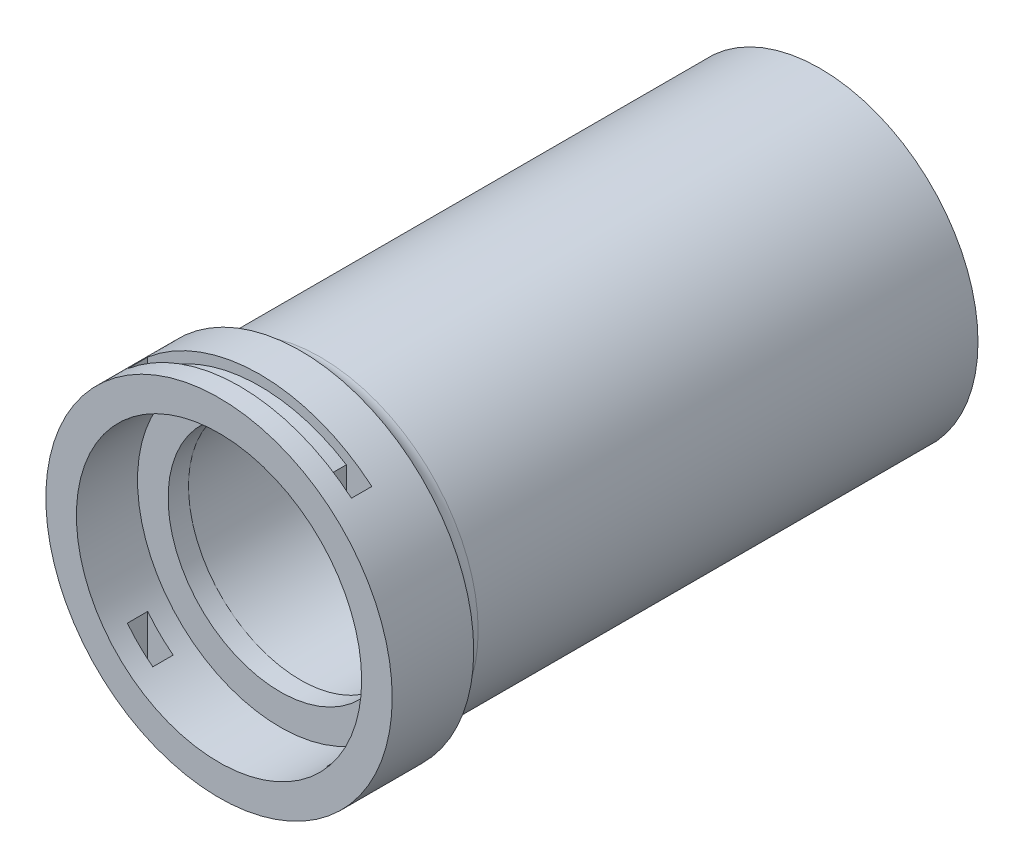
ISO-10303-21;
HEADER;
FILE_DESCRIPTION(('STEP AP214'),'2;1');
FILE_NAME('part.step','',(''),(''),'','','');
FILE_SCHEMA(('AUTOMOTIVE_DESIGN { 1 0 10303 214 1 1 1 1 }'));
ENDSEC;
DATA;
#1=APPLICATION_CONTEXT('core data for automotive mechanical design processes');
#2=APPLICATION_PROTOCOL_DEFINITION('international standard','automotive_design',2000,#1);
#3=PRODUCT_CONTEXT('',#1,'mechanical');
#4=PRODUCT('Part','Part','',(#3));
#5=PRODUCT_RELATED_PRODUCT_CATEGORY('part','',(#4));
#6=PRODUCT_DEFINITION_FORMATION('','',#4);
#7=PRODUCT_DEFINITION_CONTEXT('part definition',#1,'design');
#8=PRODUCT_DEFINITION('design','',#6,#7);
#9=PRODUCT_DEFINITION_SHAPE('','',#8);
#10=(LENGTH_UNIT() NAMED_UNIT(*) SI_UNIT(.MILLI.,.METRE.));
#11=(NAMED_UNIT(*) PLANE_ANGLE_UNIT() SI_UNIT($,.RADIAN.));
#12=(NAMED_UNIT(*) SI_UNIT($,.STERADIAN.) SOLID_ANGLE_UNIT());
#13=UNCERTAINTY_MEASURE_WITH_UNIT(LENGTH_MEASURE(1.E-05),#10,'distance_accuracy_value','');
#14=(GEOMETRIC_REPRESENTATION_CONTEXT(3) GLOBAL_UNCERTAINTY_ASSIGNED_CONTEXT((#13)) GLOBAL_UNIT_ASSIGNED_CONTEXT((#10,
#11,#12)) REPRESENTATION_CONTEXT('',''));
#15=CARTESIAN_POINT('',(0.,0.,0.));
#16=DIRECTION('',(0.,0.,1.));
#17=DIRECTION('',(1.,0.,0.));
#18=AXIS2_PLACEMENT_3D('',#15,#16,#17);
#19=CARTESIAN_POINT('',(-8.5,-20.,0.));
#20=DIRECTION('',(1.,0.,0.));
#21=DIRECTION('',(0.,0.,-1.));
#22=AXIS2_PLACEMENT_3D('',#19,#20,#21);
#23=PLANE('',#22);
#24=DIRECTION('',(0.,0.,1.));
#25=VECTOR('',#24,1.);
#26=CARTESIAN_POINT('',(-8.5,13.555441711726,22.));
#27=LINE('',#26,#25);
#28=CARTESIAN_POINT('',(-8.5,13.555441711726,22.));
#29=VERTEX_POINT('',#28);
#30=CARTESIAN_POINT('',(-8.5,13.555441711726,24.));
#31=VERTEX_POINT('',#30);
#32=EDGE_CURVE('E150',#29,#31,#27,.T.);
#33=ORIENTED_EDGE('',*,*,#32,.F.);
#34=DIRECTION('',(0.,1.,0.));
#35=VECTOR('',#34,1.);
#36=CARTESIAN_POINT('',(-8.5,-20.,22.));
#37=LINE('',#36,#35);
#38=CARTESIAN_POINT('',(-8.5,11.1242977306435,22.));
#39=VERTEX_POINT('',#38);
#40=EDGE_CURVE('E194',#39,#29,#37,.T.);
#41=ORIENTED_EDGE('',*,*,#40,.F.);
#42=DIRECTION('',(0.,0.,1.));
#43=VECTOR('',#42,1.);
#44=CARTESIAN_POINT('',(-8.5,11.1242977306435,20.));
#45=LINE('',#44,#43);
#46=CARTESIAN_POINT('',(-8.5,11.1242977306435,24.));
#47=VERTEX_POINT('',#46);
#48=EDGE_CURVE('E275',#47,#39,#45,.F.);
#49=ORIENTED_EDGE('',*,*,#48,.F.);
#50=DIRECTION('',(0.,1.,0.));
#51=VECTOR('',#50,1.);
#52=CARTESIAN_POINT('',(-8.5,-20.,24.));
#53=LINE('',#52,#51);
#54=EDGE_CURVE('E184',#47,#31,#53,.T.);
#55=ORIENTED_EDGE('',*,*,#54,.T.);
#56=EDGE_LOOP('',(#33,#41,#49,#55));
#57=FACE_BOUND('',#56,.T.);
#58=ADVANCED_FACE('F33',(#57),#23,.F.);
#59=CARTESIAN_POINT('',(8.5,-20.,0.));
#60=DIRECTION('',(1.,0.,0.));
#61=DIRECTION('',(0.,0.,-1.));
#62=AXIS2_PLACEMENT_3D('',#59,#60,#61);
#63=PLANE('',#62);
#64=DIRECTION('',(0.,1.,0.));
#65=VECTOR('',#64,1.);
#66=CARTESIAN_POINT('',(8.5,-20.,22.));
#67=LINE('',#66,#65);
#68=CARTESIAN_POINT('',(8.5,11.1242977306435,22.));
#69=VERTEX_POINT('',#68);
#70=CARTESIAN_POINT('',(8.5,13.555441711726,22.));
#71=VERTEX_POINT('',#70);
#72=EDGE_CURVE('E165',#69,#71,#67,.T.);
#73=ORIENTED_EDGE('',*,*,#72,.T.);
#74=DIRECTION('',(0.,0.,1.));
#75=VECTOR('',#74,1.);
#76=CARTESIAN_POINT('',(8.5,13.555441711726,22.));
#77=LINE('',#76,#75);
#78=CARTESIAN_POINT('',(8.5,13.555441711726,24.));
#79=VERTEX_POINT('',#78);
#80=EDGE_CURVE('E11',#71,#79,#77,.T.);
#81=ORIENTED_EDGE('',*,*,#80,.T.);
#82=DIRECTION('',(0.,1.,0.));
#83=VECTOR('',#82,1.);
#84=CARTESIAN_POINT('',(8.5,-20.,24.));
#85=LINE('',#84,#83);
#86=CARTESIAN_POINT('',(8.5,11.1242977306435,24.));
#87=VERTEX_POINT('',#86);
#88=EDGE_CURVE('E162',#87,#79,#85,.T.);
#89=ORIENTED_EDGE('',*,*,#88,.F.);
#90=DIRECTION('',(0.,0.,1.));
#91=VECTOR('',#90,1.);
#92=CARTESIAN_POINT('',(8.5,11.1242977306435,20.));
#93=LINE('',#92,#91);
#94=EDGE_CURVE('E290',#87,#69,#93,.F.);
#95=ORIENTED_EDGE('',*,*,#94,.T.);
#96=EDGE_LOOP('',(#73,#81,#89,#95));
#97=FACE_BOUND('',#96,.T.);
#98=ADVANCED_FACE('F161',(#97),#63,.T.);
#99=CARTESIAN_POINT('',(0.,0.,18.));
#100=DIRECTION('',(0.,0.,1.));
#101=DIRECTION('',(1.,0.,0.));
#102=AXIS2_PLACEMENT_3D('',#99,#100,#101);
#103=CYLINDRICAL_SURFACE('',#102,17.);
#104=CARTESIAN_POINT('',(0.,0.,22.));
#105=DIRECTION('',(0.,0.,1.));
#106=DIRECTION('',(1.,0.,0.));
#107=AXIS2_PLACEMENT_3D('',#104,#105,#106);
#108=CIRCLE('',#107,17.);
#109=CARTESIAN_POINT('',(-11.,12.9614813968157,22.));
#110=VERTEX_POINT('',#109);
#111=CARTESIAN_POINT('',(11.,12.9614813968157,22.));
#112=VERTEX_POINT('',#111);
#113=EDGE_CURVE('E199',#110,#112,#108,.F.);
#114=ORIENTED_EDGE('',*,*,#113,.T.);
#115=DIRECTION('',(0.,0.,1.));
#116=VECTOR('',#115,1.);
#117=CARTESIAN_POINT('',(11.,12.9614813968157,18.));
#118=LINE('',#117,#116);
#119=CARTESIAN_POINT('',(11.,12.9614813968157,24.));
#120=VERTEX_POINT('',#119);
#121=EDGE_CURVE('E178',#112,#120,#118,.T.);
#122=ORIENTED_EDGE('',*,*,#121,.T.);
#123=CARTESIAN_POINT('',(0.,0.,24.));
#124=DIRECTION('',(0.,0.,1.));
#125=DIRECTION('',(1.,0.,0.));
#126=AXIS2_PLACEMENT_3D('',#123,#124,#125);
#127=CIRCLE('',#126,17.);
#128=CARTESIAN_POINT('',(-11.,12.9614813968157,24.));
#129=VERTEX_POINT('',#128);
#130=EDGE_CURVE('E207',#129,#120,#127,.F.);
#131=ORIENTED_EDGE('',*,*,#130,.F.);
#132=DIRECTION('',(0.,0.,1.));
#133=VECTOR('',#132,1.);
#134=CARTESIAN_POINT('',(-11.,12.9614813968157,18.));
#135=LINE('',#134,#133);
#136=EDGE_CURVE('E202',#110,#129,#135,.T.);
#137=ORIENTED_EDGE('',*,*,#136,.F.);
#138=EDGE_LOOP('',(#114,#122,#131,#137));
#139=FACE_BOUND('',#138,.T.);
#140=CARTESIAN_POINT('',(0.,0.,26.));
#141=DIRECTION('',(0.,0.,1.));
#142=DIRECTION('',(1.,0.,0.));
#143=AXIS2_PLACEMENT_3D('',#140,#141,#142);
#144=CIRCLE('',#143,17.);
#145=CARTESIAN_POINT('',(17.,0.,26.));
#146=VERTEX_POINT('',#145);
#147=EDGE_CURVE('E220',#146,#146,#144,.T.);
#148=ORIENTED_EDGE('',*,*,#147,.F.);
#149=EDGE_LOOP('',(#148));
#150=FACE_BOUND('',#149,.T.);
#151=CARTESIAN_POINT('',(0.,0.,18.));
#152=DIRECTION('',(0.,0.,1.));
#153=DIRECTION('',(1.,0.,0.));
#154=AXIS2_PLACEMENT_3D('',#151,#152,#153);
#155=CIRCLE('',#154,17.);
#156=CARTESIAN_POINT('',(17.,0.,18.));
#157=VERTEX_POINT('',#156);
#158=EDGE_CURVE('E223',#157,#157,#155,.T.);
#159=ORIENTED_EDGE('',*,*,#158,.T.);
#160=EDGE_LOOP('',(#159));
#161=FACE_BOUND('',#160,.T.);
#162=DIRECTION('',(0.,0.,1.));
#163=VECTOR('',#162,1.);
#164=CARTESIAN_POINT('',(11.,-12.9614813968157,18.));
#165=LINE('',#164,#163);
#166=CARTESIAN_POINT('',(11.,-12.9614813968157,24.));
#167=VERTEX_POINT('',#166);
#168=CARTESIAN_POINT('',(11.,-12.9614813968157,22.));
#169=VERTEX_POINT('',#168);
#170=EDGE_CURVE('E181',#167,#169,#165,.F.);
#171=ORIENTED_EDGE('',*,*,#170,.T.);
#172=CARTESIAN_POINT('',(-11.,-12.9614813968157,22.));
#173=VERTEX_POINT('',#172);
#174=EDGE_CURVE('E201',#169,#173,#108,.F.);
#175=ORIENTED_EDGE('',*,*,#174,.T.);
#176=DIRECTION('',(0.,0.,1.));
#177=VECTOR('',#176,1.);
#178=CARTESIAN_POINT('',(-11.,-12.9614813968157,18.));
#179=LINE('',#178,#177);
#180=CARTESIAN_POINT('',(-11.,-12.9614813968157,24.));
#181=VERTEX_POINT('',#180);
#182=EDGE_CURVE('E204',#181,#173,#179,.F.);
#183=ORIENTED_EDGE('',*,*,#182,.F.);
#184=EDGE_CURVE('E56',#167,#181,#127,.F.);
#185=ORIENTED_EDGE('',*,*,#184,.F.);
#186=EDGE_LOOP('',(#171,#175,#183,#185));
#187=FACE_BOUND('',#186,.T.);
#188=ADVANCED_FACE('F364',(#139,#150,#161,#187),#103,.T.);
#189=DIRECTION('',(0.,0.,1.));
#190=VECTOR('',#189,1.);
#191=CARTESIAN_POINT('',(-8.5,-13.555441711726,22.));
#192=LINE('',#191,#190);
#193=CARTESIAN_POINT('',(-8.5,-13.555441711726,24.));
#194=VERTEX_POINT('',#193);
#195=CARTESIAN_POINT('',(-8.5,-13.555441711726,22.));
#196=VERTEX_POINT('',#195);
#197=EDGE_CURVE('E170',#194,#196,#192,.F.);
#198=ORIENTED_EDGE('',*,*,#197,.F.);
#199=CARTESIAN_POINT('',(-8.5,-11.1242977306435,24.));
#200=VERTEX_POINT('',#199);
#201=EDGE_CURVE('E197',#194,#200,#53,.T.);
#202=ORIENTED_EDGE('',*,*,#201,.T.);
#203=DIRECTION('',(0.,0.,1.));
#204=VECTOR('',#203,1.);
#205=CARTESIAN_POINT('',(-8.5,-11.1242977306435,20.));
#206=LINE('',#205,#204);
#207=CARTESIAN_POINT('',(-8.5,-11.1242977306435,22.));
#208=VERTEX_POINT('',#207);
#209=EDGE_CURVE('E250',#208,#200,#206,.T.);
#210=ORIENTED_EDGE('',*,*,#209,.F.);
#211=EDGE_CURVE('E193',#196,#208,#37,.T.);
#212=ORIENTED_EDGE('',*,*,#211,.F.);
#213=EDGE_LOOP('',(#198,#202,#210,#212));
#214=FACE_BOUND('',#213,.T.);
#215=ADVANCED_FACE('F360',(#214),#23,.F.);
#216=CARTESIAN_POINT('',(8.5,-13.555441711726,24.));
#217=VERTEX_POINT('',#216);
#218=CARTESIAN_POINT('',(8.5,-11.1242977306435,24.));
#219=VERTEX_POINT('',#218);
#220=EDGE_CURVE('E169',#217,#219,#85,.T.);
#221=ORIENTED_EDGE('',*,*,#220,.F.);
#222=DIRECTION('',(0.,0.,1.));
#223=VECTOR('',#222,1.);
#224=CARTESIAN_POINT('',(8.5,-13.555441711726,22.));
#225=LINE('',#224,#223);
#226=CARTESIAN_POINT('',(8.5,-13.555441711726,22.));
#227=VERTEX_POINT('',#226);
#228=EDGE_CURVE('E173',#217,#227,#225,.F.);
#229=ORIENTED_EDGE('',*,*,#228,.T.);
#230=CARTESIAN_POINT('',(8.5,-11.1242977306435,22.));
#231=VERTEX_POINT('',#230);
#232=EDGE_CURVE('E182',#227,#231,#67,.T.);
#233=ORIENTED_EDGE('',*,*,#232,.T.);
#234=DIRECTION('',(0.,0.,1.));
#235=VECTOR('',#234,1.);
#236=CARTESIAN_POINT('',(8.5,-11.1242977306435,20.));
#237=LINE('',#236,#235);
#238=EDGE_CURVE('E41',#231,#219,#237,.T.);
#239=ORIENTED_EDGE('',*,*,#238,.T.);
#240=EDGE_LOOP('',(#221,#229,#233,#239));
#241=FACE_BOUND('',#240,.T.);
#242=ADVANCED_FACE('F366',(#241),#63,.T.);
#243=CARTESIAN_POINT('',(0.,0.,20.));
#244=DIRECTION('',(0.,0.,1.));
#245=DIRECTION('',(1.,0.,0.));
#246=AXIS2_PLACEMENT_3D('',#243,#244,#245);
#247=CYLINDRICAL_SURFACE('',#246,14.);
#248=ORIENTED_EDGE('',*,*,#94,.F.);
#249=CARTESIAN_POINT('',(0.,0.,24.));
#250=DIRECTION('',(0.,0.,-1.));
#251=DIRECTION('',(-1.,0.,0.));
#252=AXIS2_PLACEMENT_3D('',#249,#250,#251);
#253=CIRCLE('',#252,14.);
#254=CARTESIAN_POINT('',(11.,8.66025403784439,24.));
#255=VERTEX_POINT('',#254);
#256=EDGE_CURVE('E168',#255,#87,#253,.F.);
#257=ORIENTED_EDGE('',*,*,#256,.F.);
#258=DIRECTION('',(0.,0.,1.));
#259=VECTOR('',#258,1.);
#260=CARTESIAN_POINT('',(11.,8.66025403784439,20.));
#261=LINE('',#260,#259);
#262=CARTESIAN_POINT('',(11.,8.66025403784439,22.));
#263=VERTEX_POINT('',#262);
#264=EDGE_CURVE('E283',#263,#255,#261,.T.);
#265=ORIENTED_EDGE('',*,*,#264,.F.);
#266=CARTESIAN_POINT('',(0.,0.,22.));
#267=DIRECTION('',(0.,0.,-1.));
#268=DIRECTION('',(-1.,0.,0.));
#269=AXIS2_PLACEMENT_3D('',#266,#267,#268);
#270=CIRCLE('',#269,14.);
#271=EDGE_CURVE('E287',#263,#69,#270,.F.);
#272=ORIENTED_EDGE('',*,*,#271,.T.);
#273=EDGE_LOOP('',(#248,#257,#265,#272));
#274=FACE_BOUND('',#273,.T.);
#275=DIRECTION('',(0.,0.,1.));
#276=VECTOR('',#275,1.);
#277=CARTESIAN_POINT('',(-11.,8.66025403784438,20.));
#278=LINE('',#277,#276);
#279=CARTESIAN_POINT('',(-11.,8.66025403784438,22.));
#280=VERTEX_POINT('',#279);
#281=CARTESIAN_POINT('',(-11.,8.66025403784438,24.));
#282=VERTEX_POINT('',#281);
#283=EDGE_CURVE('E279',#280,#282,#278,.T.);
#284=ORIENTED_EDGE('',*,*,#283,.T.);
#285=CARTESIAN_POINT('',(0.,0.,24.));
#286=DIRECTION('',(0.,0.,1.));
#287=DIRECTION('',(1.,0.,0.));
#288=AXIS2_PLACEMENT_3D('',#285,#286,#287);
#289=CIRCLE('',#288,14.);
#290=EDGE_CURVE('E276',#282,#47,#289,.F.);
#291=ORIENTED_EDGE('',*,*,#290,.T.);
#292=ORIENTED_EDGE('',*,*,#48,.T.);
#293=CARTESIAN_POINT('',(0.,0.,22.));
#294=DIRECTION('',(0.,0.,1.));
#295=DIRECTION('',(1.,0.,0.));
#296=AXIS2_PLACEMENT_3D('',#293,#294,#295);
#297=CIRCLE('',#296,14.);
#298=EDGE_CURVE('E269',#280,#39,#297,.F.);
#299=ORIENTED_EDGE('',*,*,#298,.F.);
#300=EDGE_LOOP('',(#284,#291,#292,#299));
#301=FACE_BOUND('',#300,.T.);
#302=ORIENTED_EDGE('',*,*,#209,.T.);
#303=CARTESIAN_POINT('',(-11.,-8.66025403784438,24.));
#304=VERTEX_POINT('',#303);
#305=EDGE_CURVE('E272',#200,#304,#289,.F.);
#306=ORIENTED_EDGE('',*,*,#305,.T.);
#307=DIRECTION('',(0.,0.,1.));
#308=VECTOR('',#307,1.);
#309=CARTESIAN_POINT('',(-11.,-8.66025403784438,20.));
#310=LINE('',#309,#308);
#311=CARTESIAN_POINT('',(-11.,-8.66025403784438,22.));
#312=VERTEX_POINT('',#311);
#313=EDGE_CURVE('E268',#304,#312,#310,.F.);
#314=ORIENTED_EDGE('',*,*,#313,.T.);
#315=EDGE_CURVE('E266',#208,#312,#297,.F.);
#316=ORIENTED_EDGE('',*,*,#315,.F.);
#317=EDGE_LOOP('',(#302,#306,#314,#316));
#318=FACE_BOUND('',#317,.T.);
#319=CARTESIAN_POINT('',(0.,0.,20.));
#320=DIRECTION('',(0.,0.,1.));
#321=DIRECTION('',(1.,0.,0.));
#322=AXIS2_PLACEMENT_3D('',#319,#320,#321);
#323=CIRCLE('',#322,14.);
#324=CARTESIAN_POINT('',(14.,0.,20.));
#325=VERTEX_POINT('',#324);
#326=EDGE_CURVE('E209',#325,#325,#323,.T.);
#327=ORIENTED_EDGE('',*,*,#326,.F.);
#328=EDGE_LOOP('',(#327));
#329=FACE_BOUND('',#328,.T.);
#330=CARTESIAN_POINT('',(0.,0.,26.));
#331=DIRECTION('',(0.,0.,1.));
#332=DIRECTION('',(1.,0.,0.));
#333=AXIS2_PLACEMENT_3D('',#330,#331,#332);
#334=CIRCLE('',#333,14.);
#335=CARTESIAN_POINT('',(14.,0.,26.));
#336=VERTEX_POINT('',#335);
#337=EDGE_CURVE('E213',#336,#336,#334,.T.);
#338=ORIENTED_EDGE('',*,*,#337,.T.);
#339=EDGE_LOOP('',(#338));
#340=FACE_BOUND('',#339,.T.);
#341=ORIENTED_EDGE('',*,*,#238,.F.);
#342=CARTESIAN_POINT('',(11.,-8.66025403784439,22.));
#343=VERTEX_POINT('',#342);
#344=EDGE_CURVE('E291',#231,#343,#270,.F.);
#345=ORIENTED_EDGE('',*,*,#344,.T.);
#346=DIRECTION('',(0.,0.,1.));
#347=VECTOR('',#346,1.);
#348=CARTESIAN_POINT('',(11.,-8.66025403784439,20.));
#349=LINE('',#348,#347);
#350=CARTESIAN_POINT('',(11.,-8.66025403784439,24.));
#351=VERTEX_POINT('',#350);
#352=EDGE_CURVE('E293',#351,#343,#349,.F.);
#353=ORIENTED_EDGE('',*,*,#352,.F.);
#354=EDGE_CURVE('E284',#219,#351,#253,.F.);
#355=ORIENTED_EDGE('',*,*,#354,.F.);
#356=EDGE_LOOP('',(#341,#345,#353,#355));
#357=FACE_BOUND('',#356,.T.);
#358=ADVANCED_FACE('F303',(#274,#301,#318,#329,#340,#357),#247,.F.);
#359=CARTESIAN_POINT('',(0.,0.,3.99999999999999));
#360=DIRECTION('',(0.,0.,1.));
#361=DIRECTION('',(1.,0.,0.));
#362=AXIS2_PLACEMENT_3D('',#359,#360,#361);
#363=PLANE('',#362);
#364=CARTESIAN_POINT('',(0.,10.,4.));
#365=DIRECTION('',(0.,0.,1.));
#366=DIRECTION('',(1.,0.,0.));
#367=AXIS2_PLACEMENT_3D('',#364,#365,#366);
#368=CIRCLE('',#367,0.5);
#369=CARTESIAN_POINT('',(0.5,10.,4.));
#370=VERTEX_POINT('',#369);
#371=EDGE_CURVE('E258',#370,#370,#368,.F.);
#372=ORIENTED_EDGE('',*,*,#371,.T.);
#373=EDGE_LOOP('',(#372));
#374=FACE_BOUND('',#373,.T.);
#375=CARTESIAN_POINT('',(0.,-10.,4.));
#376=DIRECTION('',(0.,0.,1.));
#377=DIRECTION('',(1.,0.,0.));
#378=AXIS2_PLACEMENT_3D('',#375,#376,#377);
#379=CIRCLE('',#378,0.5);
#380=CARTESIAN_POINT('',(0.5,-10.,4.));
#381=VERTEX_POINT('',#380);
#382=EDGE_CURVE('E216',#381,#381,#379,.F.);
#383=ORIENTED_EDGE('',*,*,#382,.T.);
#384=EDGE_LOOP('',(#383));
#385=FACE_BOUND('',#384,.T.);
#386=CARTESIAN_POINT('',(0.,0.,3.99999999999999));
#387=DIRECTION('',(0.,0.,1.));
#388=DIRECTION('',(1.,0.,0.));
#389=AXIS2_PLACEMENT_3D('',#386,#387,#388);
#390=CIRCLE('',#389,9.);
#391=CARTESIAN_POINT('',(9.,0.,3.99999999999999));
#392=VERTEX_POINT('',#391);
#393=EDGE_CURVE('E227',#392,#392,#390,.T.);
#394=ORIENTED_EDGE('',*,*,#393,.F.);
#395=EDGE_LOOP('',(#394));
#396=FACE_BOUND('',#395,.T.);
#397=CARTESIAN_POINT('',(0.,0.,3.99999999999999));
#398=DIRECTION('',(0.,0.,1.));
#399=DIRECTION('',(1.,0.,0.));
#400=AXIS2_PLACEMENT_3D('',#397,#398,#399);
#401=CIRCLE('',#400,11.);
#402=CARTESIAN_POINT('',(11.,0.,3.99999999999999));
#403=VERTEX_POINT('',#402);
#404=EDGE_CURVE('E234',#403,#403,#401,.T.);
#405=ORIENTED_EDGE('',*,*,#404,.T.);
#406=EDGE_LOOP('',(#405));
#407=FACE_BOUND('',#406,.T.);
#408=CARTESIAN_POINT('',(10.,0.,4.));
#409=DIRECTION('',(0.,0.,1.));
#410=DIRECTION('',(1.,0.,0.));
#411=AXIS2_PLACEMENT_3D('',#408,#409,#410);
#412=CIRCLE('',#411,0.500000000000001);
#413=CARTESIAN_POINT('',(10.5,0.,4.));
#414=VERTEX_POINT('',#413);
#415=EDGE_CURVE('E255',#414,#414,#412,.F.);
#416=ORIENTED_EDGE('',*,*,#415,.T.);
#417=EDGE_LOOP('',(#416));
#418=FACE_BOUND('',#417,.T.);
#419=CARTESIAN_POINT('',(-10.,0.,4.));
#420=DIRECTION('',(0.,0.,1.));
#421=DIRECTION('',(1.,0.,0.));
#422=AXIS2_PLACEMENT_3D('',#419,#420,#421);
#423=CIRCLE('',#422,0.500000000000001);
#424=CARTESIAN_POINT('',(-9.5,0.,4.));
#425=VERTEX_POINT('',#424);
#426=EDGE_CURVE('E261',#425,#425,#423,.F.);
#427=ORIENTED_EDGE('',*,*,#426,.T.);
#428=EDGE_LOOP('',(#427));
#429=FACE_BOUND('',#428,.T.);
#430=ADVANCED_FACE('F414',(#374,#385,#396,#407,#418,#429),#363,.T.);
#431=CARTESIAN_POINT('',(0.,0.,26.));
#432=DIRECTION('',(0.,0.,-1.));
#433=DIRECTION('',(-1.,0.,0.));
#434=AXIS2_PLACEMENT_3D('',#431,#432,#433);
#435=CYLINDRICAL_SURFACE('',#434,11.);
#436=CARTESIAN_POINT('',(0.,0.,18.));
#437=DIRECTION('',(0.,0.,1.));
#438=DIRECTION('',(1.,0.,0.));
#439=AXIS2_PLACEMENT_3D('',#436,#437,#438);
#440=CIRCLE('',#439,11.);
#441=CARTESIAN_POINT('',(11.,0.,18.));
#442=VERTEX_POINT('',#441);
#443=EDGE_CURVE('E217',#442,#442,#440,.T.);
#444=ORIENTED_EDGE('',*,*,#443,.F.);
#445=EDGE_LOOP('',(#444));
#446=FACE_BOUND('',#445,.T.);
#447=CARTESIAN_POINT('',(0.,0.,20.));
#448=DIRECTION('',(0.,0.,1.));
#449=DIRECTION('',(1.,0.,0.));
#450=AXIS2_PLACEMENT_3D('',#447,#448,#449);
#451=CIRCLE('',#450,11.);
#452=CARTESIAN_POINT('',(11.,0.,20.));
#453=VERTEX_POINT('',#452);
#454=EDGE_CURVE('E212',#453,#453,#451,.T.);
#455=ORIENTED_EDGE('',*,*,#454,.T.);
#456=EDGE_LOOP('',(#455));
#457=FACE_BOUND('',#456,.T.);
#458=ADVANCED_FACE('F419',(#446,#457),#435,.F.);
#459=CARTESIAN_POINT('',(0.,0.,18.));
#460=DIRECTION('',(0.,0.,1.));
#461=DIRECTION('',(1.,0.,0.));
#462=AXIS2_PLACEMENT_3D('',#459,#460,#461);
#463=PLANE('',#462);
#464=CARTESIAN_POINT('',(0.,0.,18.));
#465=DIRECTION('',(0.,0.,1.));
#466=DIRECTION('',(1.,0.,0.));
#467=AXIS2_PLACEMENT_3D('',#464,#465,#466);
#468=CIRCLE('',#467,11.1125);
#469=CARTESIAN_POINT('',(11.1125,0.,18.));
#470=VERTEX_POINT('',#469);
#471=EDGE_CURVE('E226',#470,#470,#468,.T.);
#472=ORIENTED_EDGE('',*,*,#471,.F.);
#473=EDGE_LOOP('',(#472));
#474=FACE_BOUND('',#473,.T.);
#475=ORIENTED_EDGE('',*,*,#443,.T.);
#476=EDGE_LOOP('',(#475));
#477=FACE_BOUND('',#476,.T.);
#478=ADVANCED_FACE('F428',(#474,#477),#463,.F.);
#479=CARTESIAN_POINT('',(0.,0.,26.));
#480=DIRECTION('',(0.,0.,1.));
#481=DIRECTION('',(1.,0.,0.));
#482=AXIS2_PLACEMENT_3D('',#479,#480,#481);
#483=PLANE('',#482);
#484=ORIENTED_EDGE('',*,*,#337,.F.);
#485=EDGE_LOOP('',(#484));
#486=FACE_BOUND('',#485,.T.);
#487=ORIENTED_EDGE('',*,*,#147,.T.);
#488=EDGE_LOOP('',(#487));
#489=FACE_BOUND('',#488,.T.);
#490=ADVANCED_FACE('F431',(#486,#489),#483,.T.);
#491=CARTESIAN_POINT('',(0.,0.,26.));
#492=DIRECTION('',(0.,0.,-1.));
#493=DIRECTION('',(-1.,0.,0.));
#494=AXIS2_PLACEMENT_3D('',#491,#492,#493);
#495=CYLINDRICAL_SURFACE('',#494,15.5);
#496=CARTESIAN_POINT('',(0.,0.,16.0635083268963));
#497=DIRECTION('',(0.,0.,1.));
#498=DIRECTION('',(1.,0.,0.));
#499=AXIS2_PLACEMENT_3D('',#496,#497,#498);
#500=CIRCLE('',#499,15.5);
#501=CARTESIAN_POINT('',(15.5,0.,16.0635083268963));
#502=VERTEX_POINT('',#501);
#503=EDGE_CURVE('E245',#502,#502,#500,.F.);
#504=ORIENTED_EDGE('',*,*,#503,.T.);
#505=EDGE_LOOP('',(#504));
#506=FACE_BOUND('',#505,.T.);
#507=CARTESIAN_POINT('',(0.,0.,-33.));
#508=DIRECTION('',(0.,0.,-1.));
#509=DIRECTION('',(-1.,0.,0.));
#510=AXIS2_PLACEMENT_3D('',#507,#508,#509);
#511=CIRCLE('',#510,15.5);
#512=CARTESIAN_POINT('',(-15.5,0.,-33.));
#513=VERTEX_POINT('',#512);
#514=EDGE_CURVE('E156',#513,#513,#511,.T.);
#515=ORIENTED_EDGE('',*,*,#514,.F.);
#516=EDGE_LOOP('',(#515));
#517=FACE_BOUND('',#516,.T.);
#518=ADVANCED_FACE('F451',(#506,#517),#495,.T.);
#519=CARTESIAN_POINT('',(0.,0.,54.));
#520=DIRECTION('',(0.,0.,-1.));
#521=DIRECTION('',(-1.,0.,0.));
#522=AXIS2_PLACEMENT_3D('',#519,#520,#521);
#523=CYLINDRICAL_SURFACE('',#522,11.1125);
#524=CARTESIAN_POINT('',(0.,0.,5.99999999999999));
#525=DIRECTION('',(0.,0.,1.));
#526=DIRECTION('',(1.,0.,0.));
#527=AXIS2_PLACEMENT_3D('',#524,#525,#526);
#528=CIRCLE('',#527,11.1125);
#529=CARTESIAN_POINT('',(11.1125,0.,5.99999999999999));
#530=VERTEX_POINT('',#529);
#531=EDGE_CURVE('E237',#530,#530,#528,.T.);
#532=ORIENTED_EDGE('',*,*,#531,.F.);
#533=EDGE_LOOP('',(#532));
#534=FACE_BOUND('',#533,.T.);
#535=ORIENTED_EDGE('',*,*,#471,.T.);
#536=EDGE_LOOP('',(#535));
#537=FACE_BOUND('',#536,.T.);
#538=ADVANCED_FACE('F448',(#534,#537),#523,.F.);
#539=CARTESIAN_POINT('',(0.,0.,5.99999999999999));
#540=DIRECTION('',(0.,0.,1.));
#541=DIRECTION('',(1.,0.,0.));
#542=AXIS2_PLACEMENT_3D('',#539,#540,#541);
#543=PLANE('',#542);
#544=CARTESIAN_POINT('',(0.,0.,5.99999999999999));
#545=DIRECTION('',(0.,0.,1.));
#546=DIRECTION('',(1.,0.,0.));
#547=AXIS2_PLACEMENT_3D('',#544,#545,#546);
#548=CIRCLE('',#547,5.625);
#549=CARTESIAN_POINT('',(5.625,0.,5.99999999999999));
#550=VERTEX_POINT('',#549);
#551=EDGE_CURVE('E242',#550,#550,#548,.F.);
#552=ORIENTED_EDGE('',*,*,#551,.T.);
#553=EDGE_LOOP('',(#552));
#554=FACE_BOUND('',#553,.T.);
#555=CARTESIAN_POINT('',(0.,0.,5.99999999999999));
#556=DIRECTION('',(0.,0.,1.));
#557=DIRECTION('',(1.,0.,0.));
#558=AXIS2_PLACEMENT_3D('',#555,#556,#557);
#559=CIRCLE('',#558,9.);
#560=CARTESIAN_POINT('',(9.,0.,5.99999999999999));
#561=VERTEX_POINT('',#560);
#562=EDGE_CURVE('E231',#561,#561,#559,.T.);
#563=ORIENTED_EDGE('',*,*,#562,.T.);
#564=EDGE_LOOP('',(#563));
#565=FACE_BOUND('',#564,.T.);
#566=ADVANCED_FACE('F447',(#554,#565),#543,.T.);
#567=CARTESIAN_POINT('',(0.,0.,0.));
#568=DIRECTION('',(0.,0.,1.));
#569=DIRECTION('',(1.,0.,0.));
#570=AXIS2_PLACEMENT_3D('',#567,#568,#569);
#571=CYLINDRICAL_SURFACE('',#570,5.625);
#572=ORIENTED_EDGE('',*,*,#551,.F.);
#573=EDGE_LOOP('',(#572));
#574=FACE_BOUND('',#573,.T.);
#575=CARTESIAN_POINT('',(0.,0.,-33.));
#576=DIRECTION('',(0.,0.,-1.));
#577=DIRECTION('',(-1.,0.,0.));
#578=AXIS2_PLACEMENT_3D('',#575,#576,#577);
#579=CIRCLE('',#578,5.625);
#580=CARTESIAN_POINT('',(-5.625,0.,-33.));
#581=VERTEX_POINT('',#580);
#582=EDGE_CURVE('E328',#581,#581,#579,.T.);
#583=ORIENTED_EDGE('',*,*,#582,.T.);
#584=EDGE_LOOP('',(#583));
#585=FACE_BOUND('',#584,.T.);
#586=ADVANCED_FACE('F445',(#574,#585),#571,.F.);
#587=CARTESIAN_POINT('',(0.,0.,5.99999999999999));
#588=DIRECTION('',(0.,0.,1.));
#589=DIRECTION('',(1.,0.,0.));
#590=AXIS2_PLACEMENT_3D('',#587,#588,#589);
#591=CIRCLE('',#590,11.);
#592=CARTESIAN_POINT('',(11.,0.,5.99999999999999));
#593=VERTEX_POINT('',#592);
#594=EDGE_CURVE('E230',#593,#593,#591,.T.);
#595=ORIENTED_EDGE('',*,*,#594,.F.);
#596=EDGE_LOOP('',(#595));
#597=FACE_BOUND('',#596,.T.);
#598=ORIENTED_EDGE('',*,*,#531,.T.);
#599=EDGE_LOOP('',(#598));
#600=FACE_BOUND('',#599,.T.);
#601=ADVANCED_FACE('F441',(#597,#600),#543,.T.);
#602=CARTESIAN_POINT('',(0.,0.,3.99999999999999));
#603=DIRECTION('',(0.,0.,1.));
#604=DIRECTION('',(1.,0.,0.));
#605=AXIS2_PLACEMENT_3D('',#602,#603,#604);
#606=CYLINDRICAL_SURFACE('',#605,11.);
#607=ORIENTED_EDGE('',*,*,#404,.F.);
#608=EDGE_LOOP('',(#607));
#609=FACE_BOUND('',#608,.T.);
#610=ORIENTED_EDGE('',*,*,#594,.T.);
#611=EDGE_LOOP('',(#610));
#612=FACE_BOUND('',#611,.T.);
#613=ADVANCED_FACE('F436',(#609,#612),#606,.F.);
#614=CARTESIAN_POINT('',(0.,0.,3.99999999999999));
#615=DIRECTION('',(0.,0.,1.));
#616=DIRECTION('',(1.,0.,0.));
#617=AXIS2_PLACEMENT_3D('',#614,#615,#616);
#618=CYLINDRICAL_SURFACE('',#617,9.);
#619=ORIENTED_EDGE('',*,*,#393,.T.);
#620=EDGE_LOOP('',(#619));
#621=FACE_BOUND('',#620,.T.);
#622=ORIENTED_EDGE('',*,*,#562,.F.);
#623=EDGE_LOOP('',(#622));
#624=FACE_BOUND('',#623,.T.);
#625=ADVANCED_FACE('F434',(#621,#624),#618,.T.);
#626=CARTESIAN_POINT('',(0.,0.,16.0635083268963));
#627=DIRECTION('',(0.,0.,1.));
#628=DIRECTION('',(1.,0.,0.));
#629=AXIS2_PLACEMENT_3D('',#626,#627,#628);
#630=TOROIDAL_SURFACE('',#629,17.5,2.);
#631=ORIENTED_EDGE('',*,*,#503,.F.);
#632=EDGE_LOOP('',(#631));
#633=FACE_BOUND('',#632,.T.);
#634=ORIENTED_EDGE('',*,*,#158,.F.);
#635=EDGE_LOOP('',(#634));
#636=FACE_BOUND('',#635,.T.);
#637=ADVANCED_FACE('F35',(#633,#636),#630,.F.);
#638=CARTESIAN_POINT('',(0.,0.,20.));
#639=DIRECTION('',(0.,0.,1.));
#640=DIRECTION('',(1.,0.,0.));
#641=AXIS2_PLACEMENT_3D('',#638,#639,#640);
#642=PLANE('',#641);
#643=ORIENTED_EDGE('',*,*,#454,.F.);
#644=EDGE_LOOP('',(#643));
#645=FACE_BOUND('',#644,.T.);
#646=ORIENTED_EDGE('',*,*,#326,.T.);
#647=EDGE_LOOP('',(#646));
#648=FACE_BOUND('',#647,.T.);
#649=ADVANCED_FACE('F424',(#645,#648),#642,.T.);
#650=CARTESIAN_POINT('',(0.,-10.,26.));
#651=DIRECTION('',(0.,0.,-1.));
#652=DIRECTION('',(-1.,0.,0.));
#653=AXIS2_PLACEMENT_3D('',#650,#651,#652);
#654=CYLINDRICAL_SURFACE('',#653,0.5);
#655=ORIENTED_EDGE('',*,*,#382,.F.);
#656=EDGE_LOOP('',(#655));
#657=FACE_BOUND('',#656,.T.);
#658=CARTESIAN_POINT('',(1.04744440165294E-13,-10.,-33.));
#659=DIRECTION('',(0.,0.,-1.));
#660=DIRECTION('',(-1.,0.,0.));
#661=AXIS2_PLACEMENT_3D('',#658,#659,#660);
#662=CIRCLE('',#661,0.500000000000001);
#663=CARTESIAN_POINT('',(-0.499999999999896,-10.,-33.));
#664=VERTEX_POINT('',#663);
#665=EDGE_CURVE('E340',#664,#664,#662,.T.);
#666=ORIENTED_EDGE('',*,*,#665,.T.);
#667=EDGE_LOOP('',(#666));
#668=FACE_BOUND('',#667,.T.);
#669=ADVANCED_FACE('F344',(#657,#668),#654,.F.);
#670=CARTESIAN_POINT('',(10.,0.,26.));
#671=DIRECTION('',(0.,0.,-1.));
#672=DIRECTION('',(-1.,0.,0.));
#673=AXIS2_PLACEMENT_3D('',#670,#671,#672);
#674=CYLINDRICAL_SURFACE('',#673,0.500000000000001);
#675=ORIENTED_EDGE('',*,*,#415,.F.);
#676=EDGE_LOOP('',(#675));
#677=FACE_BOUND('',#676,.T.);
#678=CARTESIAN_POINT('',(10.,0.,-33.));
#679=DIRECTION('',(0.,0.,-1.));
#680=DIRECTION('',(-1.,0.,0.));
#681=AXIS2_PLACEMENT_3D('',#678,#679,#680);
#682=CIRCLE('',#681,0.500000000000001);
#683=CARTESIAN_POINT('',(9.5,0.,-33.));
#684=VERTEX_POINT('',#683);
#685=EDGE_CURVE('E331',#684,#684,#682,.T.);
#686=ORIENTED_EDGE('',*,*,#685,.T.);
#687=EDGE_LOOP('',(#686));
#688=FACE_BOUND('',#687,.T.);
#689=ADVANCED_FACE('F474',(#677,#688),#674,.F.);
#690=CARTESIAN_POINT('',(0.,10.,26.));
#691=DIRECTION('',(0.,0.,-1.));
#692=DIRECTION('',(-1.,0.,0.));
#693=AXIS2_PLACEMENT_3D('',#690,#691,#692);
#694=CYLINDRICAL_SURFACE('',#693,0.5);
#695=ORIENTED_EDGE('',*,*,#371,.F.);
#696=EDGE_LOOP('',(#695));
#697=FACE_BOUND('',#696,.T.);
#698=CARTESIAN_POINT('',(0.,10.,-33.));
#699=DIRECTION('',(0.,0.,-1.));
#700=DIRECTION('',(-1.,0.,0.));
#701=AXIS2_PLACEMENT_3D('',#698,#699,#700);
#702=CIRCLE('',#701,0.5);
#703=CARTESIAN_POINT('',(-0.500000000000035,10.,-33.));
#704=VERTEX_POINT('',#703);
#705=EDGE_CURVE('E334',#704,#704,#702,.T.);
#706=ORIENTED_EDGE('',*,*,#705,.T.);
#707=EDGE_LOOP('',(#706));
#708=FACE_BOUND('',#707,.T.);
#709=ADVANCED_FACE('F471',(#697,#708),#694,.F.);
#710=CARTESIAN_POINT('',(-10.,0.,26.));
#711=DIRECTION('',(0.,0.,-1.));
#712=DIRECTION('',(-1.,0.,0.));
#713=AXIS2_PLACEMENT_3D('',#710,#711,#712);
#714=CYLINDRICAL_SURFACE('',#713,0.500000000000001);
#715=ORIENTED_EDGE('',*,*,#426,.F.);
#716=EDGE_LOOP('',(#715));
#717=FACE_BOUND('',#716,.T.);
#718=CARTESIAN_POINT('',(-10.,0.,-33.));
#719=DIRECTION('',(0.,0.,-1.));
#720=DIRECTION('',(-1.,0.,0.));
#721=AXIS2_PLACEMENT_3D('',#718,#719,#720);
#722=CIRCLE('',#721,0.500000000000001);
#723=CARTESIAN_POINT('',(-10.5,0.,-33.));
#724=VERTEX_POINT('',#723);
#725=EDGE_CURVE('E337',#724,#724,#722,.T.);
#726=ORIENTED_EDGE('',*,*,#725,.T.);
#727=EDGE_LOOP('',(#726));
#728=FACE_BOUND('',#727,.T.);
#729=ADVANCED_FACE('F473',(#717,#728),#714,.F.);
#730=CARTESIAN_POINT('',(0.,-20.,22.));
#731=DIRECTION('',(0.,0.,1.));
#732=DIRECTION('',(1.,0.,0.));
#733=AXIS2_PLACEMENT_3D('',#730,#731,#732);
#734=PLANE('',#733);
#735=ORIENTED_EDGE('',*,*,#174,.F.);
#736=DIRECTION('',(0.,1.,0.));
#737=VECTOR('',#736,1.);
#738=CARTESIAN_POINT('',(11.,-20.,22.));
#739=LINE('',#738,#737);
#740=EDGE_CURVE('E310',#169,#343,#739,.T.);
#741=ORIENTED_EDGE('',*,*,#740,.T.);
#742=ORIENTED_EDGE('',*,*,#344,.F.);
#743=ORIENTED_EDGE('',*,*,#232,.F.);
#744=CARTESIAN_POINT('',(0.,0.,22.));
#745=DIRECTION('',(0.,0.,1.));
#746=DIRECTION('',(1.,0.,0.));
#747=AXIS2_PLACEMENT_3D('',#744,#745,#746);
#748=CIRCLE('',#747,16.);
#749=EDGE_CURVE('E321',#196,#227,#748,.T.);
#750=ORIENTED_EDGE('',*,*,#749,.F.);
#751=ORIENTED_EDGE('',*,*,#211,.T.);
#752=ORIENTED_EDGE('',*,*,#315,.T.);
#753=DIRECTION('',(0.,1.,0.));
#754=VECTOR('',#753,1.);
#755=CARTESIAN_POINT('',(-11.,-20.,22.));
#756=LINE('',#755,#754);
#757=EDGE_CURVE('E189',#173,#312,#756,.T.);
#758=ORIENTED_EDGE('',*,*,#757,.F.);
#759=EDGE_LOOP('',(#735,#741,#742,#743,#750,#751,#752,#758));
#760=FACE_BOUND('',#759,.T.);
#761=ADVANCED_FACE('F307',(#760),#734,.T.);
#762=CARTESIAN_POINT('',(-11.,-20.,0.));
#763=DIRECTION('',(-1.,0.,0.));
#764=DIRECTION('',(0.,0.,1.));
#765=AXIS2_PLACEMENT_3D('',#762,#763,#764);
#766=PLANE('',#765);
#767=ORIENTED_EDGE('',*,*,#182,.T.);
#768=ORIENTED_EDGE('',*,*,#757,.T.);
#769=ORIENTED_EDGE('',*,*,#313,.F.);
#770=DIRECTION('',(0.,1.,0.));
#771=VECTOR('',#770,1.);
#772=CARTESIAN_POINT('',(-11.,-20.,24.));
#773=LINE('',#772,#771);
#774=EDGE_CURVE('E188',#181,#304,#773,.T.);
#775=ORIENTED_EDGE('',*,*,#774,.F.);
#776=EDGE_LOOP('',(#767,#768,#769,#775));
#777=FACE_BOUND('',#776,.T.);
#778=ADVANCED_FACE('F390',(#777),#766,.F.);
#779=CARTESIAN_POINT('',(0.,-20.,24.));
#780=DIRECTION('',(0.,0.,1.));
#781=DIRECTION('',(1.,0.,0.));
#782=AXIS2_PLACEMENT_3D('',#779,#780,#781);
#783=PLANE('',#782);
#784=ORIENTED_EDGE('',*,*,#201,.F.);
#785=CARTESIAN_POINT('',(0.,0.,24.));
#786=DIRECTION('',(0.,0.,1.));
#787=DIRECTION('',(1.,0.,0.));
#788=AXIS2_PLACEMENT_3D('',#785,#786,#787);
#789=CIRCLE('',#788,16.);
#790=EDGE_CURVE('E48',#194,#217,#789,.T.);
#791=ORIENTED_EDGE('',*,*,#790,.T.);
#792=ORIENTED_EDGE('',*,*,#220,.T.);
#793=ORIENTED_EDGE('',*,*,#354,.T.);
#794=DIRECTION('',(0.,1.,0.));
#795=VECTOR('',#794,1.);
#796=CARTESIAN_POINT('',(11.,-20.,24.));
#797=LINE('',#796,#795);
#798=EDGE_CURVE('E317',#167,#351,#797,.T.);
#799=ORIENTED_EDGE('',*,*,#798,.F.);
#800=ORIENTED_EDGE('',*,*,#184,.T.);
#801=ORIENTED_EDGE('',*,*,#774,.T.);
#802=ORIENTED_EDGE('',*,*,#305,.F.);
#803=EDGE_LOOP('',(#784,#791,#792,#793,#799,#800,#801,#802));
#804=FACE_BOUND('',#803,.T.);
#805=ADVANCED_FACE('F382',(#804),#783,.F.);
#806=ORIENTED_EDGE('',*,*,#130,.T.);
#807=EDGE_CURVE('E172',#255,#120,#797,.T.);
#808=ORIENTED_EDGE('',*,*,#807,.F.);
#809=ORIENTED_EDGE('',*,*,#256,.T.);
#810=ORIENTED_EDGE('',*,*,#88,.T.);
#811=CARTESIAN_POINT('',(0.,0.,24.));
#812=DIRECTION('',(0.,0.,1.));
#813=DIRECTION('',(-1.,0.,0.));
#814=AXIS2_PLACEMENT_3D('',#811,#812,#813);
#815=CIRCLE('',#814,16.);
#816=EDGE_CURVE('E146',#79,#31,#815,.T.);
#817=ORIENTED_EDGE('',*,*,#816,.T.);
#818=ORIENTED_EDGE('',*,*,#54,.F.);
#819=ORIENTED_EDGE('',*,*,#290,.F.);
#820=EDGE_CURVE('E185',#282,#129,#773,.T.);
#821=ORIENTED_EDGE('',*,*,#820,.T.);
#822=EDGE_LOOP('',(#806,#808,#809,#810,#817,#818,#819,#821));
#823=FACE_BOUND('',#822,.T.);
#824=ADVANCED_FACE('F166',(#823),#783,.F.);
#825=ORIENTED_EDGE('',*,*,#136,.T.);
#826=ORIENTED_EDGE('',*,*,#820,.F.);
#827=ORIENTED_EDGE('',*,*,#283,.F.);
#828=EDGE_CURVE('E190',#280,#110,#756,.T.);
#829=ORIENTED_EDGE('',*,*,#828,.T.);
#830=EDGE_LOOP('',(#825,#826,#827,#829));
#831=FACE_BOUND('',#830,.T.);
#832=ADVANCED_FACE('F408',(#831),#766,.F.);
#833=ORIENTED_EDGE('',*,*,#40,.T.);
#834=CARTESIAN_POINT('',(0.,0.,22.));
#835=DIRECTION('',(0.,0.,1.));
#836=DIRECTION('',(-1.,0.,0.));
#837=AXIS2_PLACEMENT_3D('',#834,#835,#836);
#838=CIRCLE('',#837,16.);
#839=EDGE_CURVE('E155',#71,#29,#838,.T.);
#840=ORIENTED_EDGE('',*,*,#839,.F.);
#841=ORIENTED_EDGE('',*,*,#72,.F.);
#842=ORIENTED_EDGE('',*,*,#271,.F.);
#843=EDGE_CURVE('E314',#263,#112,#739,.T.);
#844=ORIENTED_EDGE('',*,*,#843,.T.);
#845=ORIENTED_EDGE('',*,*,#113,.F.);
#846=ORIENTED_EDGE('',*,*,#828,.F.);
#847=ORIENTED_EDGE('',*,*,#298,.T.);
#848=EDGE_LOOP('',(#833,#840,#841,#842,#844,#845,#846,#847));
#849=FACE_BOUND('',#848,.T.);
#850=ADVANCED_FACE('F404',(#849),#734,.T.);
#851=CARTESIAN_POINT('',(11.,-20.,0.));
#852=DIRECTION('',(-1.,0.,0.));
#853=DIRECTION('',(0.,0.,1.));
#854=AXIS2_PLACEMENT_3D('',#851,#852,#853);
#855=PLANE('',#854);
#856=ORIENTED_EDGE('',*,*,#843,.F.);
#857=ORIENTED_EDGE('',*,*,#264,.T.);
#858=ORIENTED_EDGE('',*,*,#807,.T.);
#859=ORIENTED_EDGE('',*,*,#121,.F.);
#860=EDGE_LOOP('',(#856,#857,#858,#859));
#861=FACE_BOUND('',#860,.T.);
#862=ADVANCED_FACE('F397',(#861),#855,.T.);
#863=ORIENTED_EDGE('',*,*,#798,.T.);
#864=ORIENTED_EDGE('',*,*,#352,.T.);
#865=ORIENTED_EDGE('',*,*,#740,.F.);
#866=ORIENTED_EDGE('',*,*,#170,.F.);
#867=EDGE_LOOP('',(#863,#864,#865,#866));
#868=FACE_BOUND('',#867,.T.);
#869=ADVANCED_FACE('F392',(#868),#855,.T.);
#870=CARTESIAN_POINT('',(0.,0.,22.));
#871=DIRECTION('',(0.,0.,1.));
#872=DIRECTION('',(1.,0.,0.));
#873=AXIS2_PLACEMENT_3D('',#870,#871,#872);
#874=CYLINDRICAL_SURFACE('',#873,16.);
#875=ORIENTED_EDGE('',*,*,#197,.T.);
#876=ORIENTED_EDGE('',*,*,#749,.T.);
#877=ORIENTED_EDGE('',*,*,#228,.F.);
#878=ORIENTED_EDGE('',*,*,#790,.F.);
#879=EDGE_LOOP('',(#875,#876,#877,#878));
#880=FACE_BOUND('',#879,.T.);
#881=ADVANCED_FACE('F353',(#880),#874,.T.);
#882=CARTESIAN_POINT('',(0.,0.,22.));
#883=DIRECTION('',(0.,0.,1.));
#884=DIRECTION('',(1.,0.,0.));
#885=AXIS2_PLACEMENT_3D('',#882,#883,#884);
#886=CYLINDRICAL_SURFACE('',#885,16.);
#887=ORIENTED_EDGE('',*,*,#32,.T.);
#888=ORIENTED_EDGE('',*,*,#816,.F.);
#889=ORIENTED_EDGE('',*,*,#80,.F.);
#890=ORIENTED_EDGE('',*,*,#839,.T.);
#891=EDGE_LOOP('',(#887,#888,#889,#890));
#892=FACE_BOUND('',#891,.T.);
#893=ADVANCED_FACE('F147',(#892),#886,.T.);
#894=CARTESIAN_POINT('',(0.,0.,-33.));
#895=DIRECTION('',(0.,0.,-1.));
#896=DIRECTION('',(-1.,0.,0.));
#897=AXIS2_PLACEMENT_3D('',#894,#895,#896);
#898=PLANE('',#897);
#899=ORIENTED_EDGE('',*,*,#725,.F.);
#900=EDGE_LOOP('',(#899));
#901=FACE_BOUND('',#900,.T.);
#902=ORIENTED_EDGE('',*,*,#685,.F.);
#903=EDGE_LOOP('',(#902));
#904=FACE_BOUND('',#903,.T.);
#905=ORIENTED_EDGE('',*,*,#514,.T.);
#906=EDGE_LOOP('',(#905));
#907=FACE_BOUND('',#906,.T.);
#908=ORIENTED_EDGE('',*,*,#582,.F.);
#909=EDGE_LOOP('',(#908));
#910=FACE_BOUND('',#909,.T.);
#911=ORIENTED_EDGE('',*,*,#705,.F.);
#912=EDGE_LOOP('',(#911));
#913=FACE_BOUND('',#912,.T.);
#914=ORIENTED_EDGE('',*,*,#665,.F.);
#915=EDGE_LOOP('',(#914));
#916=FACE_BOUND('',#915,.T.);
#917=ADVANCED_FACE('F346',(#901,#904,#907,#910,#913,#916),#898,.T.);
#918=CLOSED_SHELL('',(#58,#98,#188,#215,#242,#358,#430,#458,#478,#490,#518,#538,#566,#586,#601,
#613,#625,#637,#649,#669,#689,#709,#729,#761,#778,#805,#824,#832,#850,#862,#869,#881,#893,#917));
#919=MANIFOLD_SOLID_BREP('B2',#918);
#920=ADVANCED_BREP_SHAPE_REPRESENTATION('',(#18,#919),#14);
#921=SHAPE_DEFINITION_REPRESENTATION(#9,#920);
ENDSEC;
END-ISO-10303-21;
